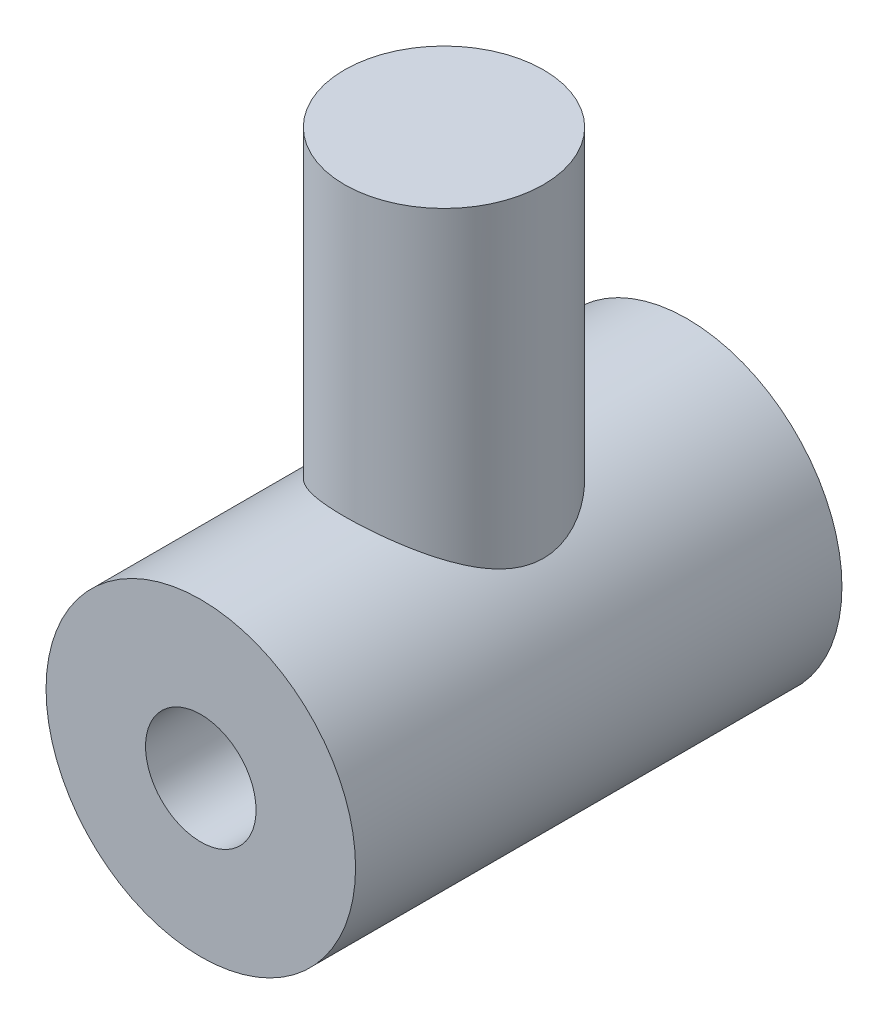
ISO-10303-21;
HEADER;
FILE_DESCRIPTION(('STEP AP214'),'2;1');
FILE_NAME('part.step','',(''),(''),'','','');
FILE_SCHEMA(('AUTOMOTIVE_DESIGN { 1 0 10303 214 1 1 1 1 }'));
ENDSEC;
DATA;
#1=APPLICATION_CONTEXT('core data for automotive mechanical design processes');
#2=APPLICATION_PROTOCOL_DEFINITION('international standard','automotive_design',2000,#1);
#3=PRODUCT_CONTEXT('',#1,'mechanical');
#4=PRODUCT('Part','Part','',(#3));
#5=PRODUCT_RELATED_PRODUCT_CATEGORY('part','',(#4));
#6=PRODUCT_DEFINITION_FORMATION('','',#4);
#7=PRODUCT_DEFINITION_CONTEXT('part definition',#1,'design');
#8=PRODUCT_DEFINITION('design','',#6,#7);
#9=PRODUCT_DEFINITION_SHAPE('','',#8);
#10=(LENGTH_UNIT() NAMED_UNIT(*) SI_UNIT(.MILLI.,.METRE.));
#11=(NAMED_UNIT(*) PLANE_ANGLE_UNIT() SI_UNIT($,.RADIAN.));
#12=(NAMED_UNIT(*) SI_UNIT($,.STERADIAN.) SOLID_ANGLE_UNIT());
#13=UNCERTAINTY_MEASURE_WITH_UNIT(LENGTH_MEASURE(1.E-05),#10,'distance_accuracy_value','');
#14=(GEOMETRIC_REPRESENTATION_CONTEXT(3) GLOBAL_UNCERTAINTY_ASSIGNED_CONTEXT((#13)) GLOBAL_UNIT_ASSIGNED_CONTEXT((#10,
#11,#12)) REPRESENTATION_CONTEXT('',''));
#15=CARTESIAN_POINT('',(0.,0.,0.));
#16=DIRECTION('',(0.,0.,1.));
#17=DIRECTION('',(1.,0.,0.));
#18=AXIS2_PLACEMENT_3D('',#15,#16,#17);
#19=CARTESIAN_POINT('',(0.,0.,44.));
#20=DIRECTION('',(0.,0.,-1.));
#21=DIRECTION('',(-1.,0.,0.));
#22=AXIS2_PLACEMENT_3D('',#19,#20,#21);
#23=CYLINDRICAL_SURFACE('',#22,14.);
#24=CARTESIAN_POINT('',(0.,0.,44.));
#25=DIRECTION('',(0.,0.,1.));
#26=DIRECTION('',(1.,0.,0.));
#27=AXIS2_PLACEMENT_3D('',#24,#25,#26);
#28=CIRCLE('',#27,14.);
#29=CARTESIAN_POINT('',(14.,0.,44.));
#30=VERTEX_POINT('',#29);
#31=EDGE_CURVE('E50',#30,#30,#28,.T.);
#32=ORIENTED_EDGE('',*,*,#31,.F.);
#33=EDGE_LOOP('',(#32));
#34=FACE_BOUND('',#33,.T.);
#35=CARTESIAN_POINT('',(0.,0.,0.));
#36=DIRECTION('',(0.,0.,1.));
#37=DIRECTION('',(1.,0.,0.));
#38=AXIS2_PLACEMENT_3D('',#35,#36,#37);
#39=CIRCLE('',#38,14.);
#40=CARTESIAN_POINT('',(14.,0.,0.));
#41=VERTEX_POINT('',#40);
#42=EDGE_CURVE('E54',#41,#41,#39,.T.);
#43=ORIENTED_EDGE('',*,*,#42,.T.);
#44=EDGE_LOOP('',(#43));
#45=FACE_BOUND('',#44,.T.);
#46=CARTESIAN_POINT('',(0.,14.,13.));
#47=CARTESIAN_POINT('',(-0.227584114263709,14.0000010523587,12.9999988244995));
#48=CARTESIAN_POINT('',(-0.455155155475848,13.9944394214491,13.0086426166343));
#49=CARTESIAN_POINT('',(-0.908539798475354,13.9723325780814,13.0430890525551));
#50=CARTESIAN_POINT('',(-1.1343527483359,13.9557834708366,13.0688977808891));
#51=CARTESIAN_POINT('',(-1.58268557077022,13.9120779988972,13.1373476155208));
#52=CARTESIAN_POINT('',(-1.80520038594632,13.8849068043828,13.1800122557582));
#53=CARTESIAN_POINT('',(-2.2449931732153,13.8206148859361,13.2815746993585));
#54=CARTESIAN_POINT('',(-2.46227153758465,13.7834949098345,13.3404712826072));
#55=CARTESIAN_POINT('',(-2.88913666728327,13.7003627407593,13.4734171316268));
#56=CARTESIAN_POINT('',(-3.09875660842831,13.6543961885736,13.547388733844));
#57=CARTESIAN_POINT('',(-3.51029963681204,13.5544328113621,13.7098404217702));
#58=CARTESIAN_POINT('',(-3.71222260586869,13.5004358630972,13.7983207301404));
#59=CARTESIAN_POINT('',(-4.10737619282889,13.385506088956,13.988910393536));
#60=CARTESIAN_POINT('',(-4.30060989003897,13.3245757475974,14.0910148687164));
#61=CARTESIAN_POINT('',(-4.67775762072026,13.1969045445948,14.3080583360774));
#62=CARTESIAN_POINT('',(-4.86166816916943,13.1301615351287,14.423002076929));
#63=CARTESIAN_POINT('',(-5.42770401989126,12.9116933952018,14.8056806890698));
#64=CARTESIAN_POINT('',(-5.79175114775062,12.7513627466614,15.0957170426228));
#65=CARTESIAN_POINT('',(-6.46927392663148,12.4213857091602,15.7259953108027));
#66=CARTESIAN_POINT('',(-6.7826779733315,12.2517265768194,16.0663070315993));
#67=CARTESIAN_POINT('',(-7.2323633835406,11.9887040552473,16.6368962570121));
#68=CARTESIAN_POINT('',(-7.38712469035751,11.8937028280017,16.8520921312977));
#69=CARTESIAN_POINT('',(-7.67789324960542,11.7081029178478,17.2967539024342));
#70=CARTESIAN_POINT('',(-7.81389667575186,11.6175051355998,17.5262226969046));
#71=CARTESIAN_POINT('',(-8.06583311344411,11.4440252086588,17.9982724844369));
#72=CARTESIAN_POINT('',(-8.18179347246911,11.3611326232973,18.2408350089503));
#73=CARTESIAN_POINT('',(-8.39252437593429,11.206365861224,18.7383396889674));
#74=CARTESIAN_POINT('',(-8.48730430526321,11.1344868089544,18.9932763004132));
#75=CARTESIAN_POINT('',(-8.63146925477076,11.0228689548488,19.4431718884227));
#76=CARTESIAN_POINT('',(-8.68618965453367,10.9797057210799,19.6355856276811));
#77=CARTESIAN_POINT('',(-8.78299303835611,10.9024252549794,20.0253296699104));
#78=CARTESIAN_POINT('',(-8.82507926449128,10.8683057021976,20.2226586974612));
#79=CARTESIAN_POINT('',(-8.89600975786495,10.8103244169902,20.6209186538799));
#80=CARTESIAN_POINT('',(-8.92487086742652,10.7864496402144,20.8218446610255));
#81=CARTESIAN_POINT('',(-8.96897989899933,10.7498013047619,21.2262063773333));
#82=CARTESIAN_POINT('',(-8.98422767770415,10.7370278629481,21.4296421128923));
#83=CARTESIAN_POINT('',(-9.00087329236168,10.7230779876452,21.8381396734402));
#84=CARTESIAN_POINT('',(-9.00222634939271,10.7219390490682,22.0432046256774));
#85=CARTESIAN_POINT('',(-8.99094192178524,10.7314032450096,22.4526739533177));
#86=CARTESIAN_POINT('',(-8.97830436883988,10.742006436857,22.6570783254907));
#87=CARTESIAN_POINT('',(-8.93924570937217,10.7745313698189,23.0637933207048));
#88=CARTESIAN_POINT('',(-8.91281467409277,10.7964612639478,23.2661023283488));
#89=CARTESIAN_POINT('',(-8.84659021172395,10.8507911739408,23.6670765107618));
#90=CARTESIAN_POINT('',(-8.80679650571715,10.8831914083506,23.8657416093807));
#91=CARTESIAN_POINT('',(-8.71586235953827,10.9561407831623,24.2520814669792));
#92=CARTESIAN_POINT('',(-8.66511985483929,10.996400327699,24.4399051819368));
#93=CARTESIAN_POINT('',(-8.55218362489436,11.0844615416764,24.8102815683309));
#94=CARTESIAN_POINT('',(-8.48998597043926,11.1322657982072,24.992832406197));
#95=CARTESIAN_POINT('',(-8.2870308542094,11.2851117674562,25.5316126320755));
#96=CARTESIAN_POINT('',(-8.1298632050726,11.3996268964678,25.879170424209));
#97=CARTESIAN_POINT('',(-7.84726764845702,11.5946929982035,26.4126499988613));
#98=CARTESIAN_POINT('',(-7.73451452449822,11.6703698168944,26.6073388362915));
#99=CARTESIAN_POINT('',(-7.49549767277604,11.8253048590925,26.9867597908817));
#100=CARTESIAN_POINT('',(-7.36923264641514,11.9045634264097,27.171490948462));
#101=CARTESIAN_POINT('',(-6.97065977989983,12.1452037368987,27.7104877777125));
#102=CARTESIAN_POINT('',(-6.67867917733987,12.3093747546297,28.0493596741495));
#103=CARTESIAN_POINT('',(-6.17526100428385,12.566250669035,28.5525913800774));
#104=CARTESIAN_POINT('',(-5.97935408914721,12.6608691190478,28.7318790268634));
#105=CARTESIAN_POINT('',(-5.57111742933795,12.8457301775098,29.073431823847));
#106=CARTESIAN_POINT('',(-5.35878492120699,12.9359720454652,29.235694098811));
#107=CARTESIAN_POINT('',(-4.91881563156702,13.1095827935413,29.541684792617));
#108=CARTESIAN_POINT('',(-4.69119195461521,13.1929574258413,29.6854287809968));
#109=CARTESIAN_POINT('',(-4.2215945025049,13.3506338458713,29.9530570024283));
#110=CARTESIAN_POINT('',(-3.97962473594526,13.4249381504561,30.0769467476781));
#111=CARTESIAN_POINT('',(-3.53208071378516,13.5486948221538,30.280840390112));
#112=CARTESIAN_POINT('',(-3.32879847718645,13.6001539098909,30.3646756495916));
#113=CARTESIAN_POINT('',(-2.91495242724517,13.6948195220994,30.5177286415945));
#114=CARTESIAN_POINT('',(-2.7043899451497,13.7380275460118,30.5869490302763));
#115=CARTESIAN_POINT('',(-2.27729014116063,13.8152456453771,30.7099542632604));
#116=CARTESIAN_POINT('',(-2.06075661227703,13.8492614181943,30.7637486698684));
#117=CARTESIAN_POINT('',(-1.62299342153234,13.907359155793,30.8552747334951));
#118=CARTESIAN_POINT('',(-1.40176367405861,13.9314409393128,30.8930060974182));
#119=CARTESIAN_POINT('',(-0.955434761233277,13.9691614934955,30.951982446389));
#120=CARTESIAN_POINT('',(-0.730324774523155,13.9827634713495,30.9731693501488));
#121=CARTESIAN_POINT('',(-0.27875079856254,13.9990478797374,30.9985241284248));
#122=CARTESIAN_POINT('',(-0.0522868088768813,14.0017303067617,31.002691997471));
#123=CARTESIAN_POINT('',(0.400183447283929,13.9961083228641,30.9939456865457));
#124=CARTESIAN_POINT('',(0.626189690131639,13.9878033585888,30.9810306462349));
#125=CARTESIAN_POINT('',(1.07593093202222,13.9604127810463,30.9383104518002));
#126=CARTESIAN_POINT('',(1.29966599332604,13.9413274641228,30.9085057619599));
#127=CARTESIAN_POINT('',(1.73091777113891,13.894184241643,30.8345411874699));
#128=CARTESIAN_POINT('',(1.93864791343421,13.8666799035894,30.7912647277375));
#129=CARTESIAN_POINT('',(2.34935677126776,13.8030330661935,30.6905262511641));
#130=CARTESIAN_POINT('',(2.55233383331183,13.7668876084032,30.6330593757482));
#131=CARTESIAN_POINT('',(2.95227642121394,13.6866962369153,30.5045969970218));
#132=CARTESIAN_POINT('',(3.1492436817517,13.6426526286864,30.4336054411867));
#133=CARTESIAN_POINT('',(3.53635492357144,13.5474700503308,30.2787484115607));
#134=CARTESIAN_POINT('',(3.72649626649201,13.496328373037,30.1948780245454));
#135=CARTESIAN_POINT('',(4.11262009384165,13.3839330149712,30.0084697688126));
#136=CARTESIAN_POINT('',(4.30802658471373,13.3222150216949,29.9050193376557));
#137=CARTESIAN_POINT('',(4.68932267687052,13.1928317683758,29.6849680350346));
#138=CARTESIAN_POINT('',(4.87520824190476,13.1251640185138,29.5683616523094));
#139=CARTESIAN_POINT('',(5.23685648362507,12.9851049765486,29.3227815878161));
#140=CARTESIAN_POINT('',(5.41261498410384,12.9127117616324,29.1938028615353));
#141=CARTESIAN_POINT('',(5.75345872233389,12.7644920967338,28.9242280912652));
#142=CARTESIAN_POINT('',(5.91854287881132,12.6886653002602,28.7836308736391));
#143=CARTESIAN_POINT('',(6.26211372085565,12.5230847426479,28.4690181864467));
#144=CARTESIAN_POINT('',(6.43877030195514,12.4329792500903,28.2931851850638));
#145=CARTESIAN_POINT('',(6.77677992498015,12.2520208958594,27.9276671667889));
#146=CARTESIAN_POINT('',(6.9381294835863,12.1611678691619,27.7379790142697));
#147=CARTESIAN_POINT('',(7.24491847850782,11.9809354051185,27.3453936903476));
#148=CARTESIAN_POINT('',(7.39035389147386,11.8915563452431,27.1424931992409));
#149=CARTESIAN_POINT('',(7.66453519513865,11.7167115834154,26.7241331032923));
#150=CARTESIAN_POINT('',(7.79328366472108,11.63124527809,26.5086754465766));
#151=CARTESIAN_POINT('',(8.01739397396806,11.4776888694133,26.0950200518325));
#152=CARTESIAN_POINT('',(8.11491961628541,11.4087935574105,25.8982926695742));
#153=CARTESIAN_POINT('',(8.29604890794173,11.277768811105,25.4963075289627));
#154=CARTESIAN_POINT('',(8.37965180987974,11.2156397400899,25.2910493133958));
#155=CARTESIAN_POINT('',(8.53204610960835,11.1001500391114,24.8729164181885));
#156=CARTESIAN_POINT('',(8.60085140759931,11.0467811914491,24.6600491073842));
#157=CARTESIAN_POINT('',(8.72285033214916,10.9507040749285,24.227624987526));
#158=CARTESIAN_POINT('',(8.77605179301215,10.9079904579559,24.0080715967214));
#159=CARTESIAN_POINT('',(8.86650123644315,10.8346019194506,23.561287965005));
#160=CARTESIAN_POINT('',(8.90358036795438,10.8040546839512,23.3340021520036));
#161=CARTESIAN_POINT('',(8.96025981543988,10.7570958867791,22.8757973645155));
#162=CARTESIAN_POINT('',(8.97986062103364,10.740683929136,22.6448784919861));
#163=CARTESIAN_POINT('',(9.00114652874405,10.7228521698632,22.1817906728734));
#164=CARTESIAN_POINT('',(9.00284395750778,10.7214220530967,21.9496226965148));
#165=CARTESIAN_POINT('',(8.98831428466094,10.7336059169077,21.4862628590491));
#166=CARTESIAN_POINT('',(8.9720887273281,10.7472186013697,21.2550709155681));
#167=CARTESIAN_POINT('',(8.92581777778007,10.7856626365133,20.8302169273008));
#168=CARTESIAN_POINT('',(8.8981962725523,10.8085164994393,20.6361032112709));
#169=CARTESIAN_POINT('',(8.83065688188754,10.8637645488616,20.2513791833468));
#170=CARTESIAN_POINT('',(8.79073551289445,10.8961614380107,20.060769880196));
#171=CARTESIAN_POINT('',(8.65322824370674,11.0061611478916,19.4956274657335));
#172=CARTESIAN_POINT('',(8.53790173700453,11.0965707538941,19.1278025824511));
#173=CARTESIAN_POINT('',(8.21717622938521,11.3371215888667,18.2930821357949));
#174=CARTESIAN_POINT('',(7.99443564846415,11.4971108667669,17.8356897183434));
#175=CARTESIAN_POINT('',(7.60909509065919,11.7526874131231,17.186975584117));
#176=CARTESIAN_POINT('',(7.47193221128204,11.8405828229634,16.9767577126606));
#177=CARTESIAN_POINT('',(7.18115062783324,12.019156557909,16.5691921956239));
#178=CARTESIAN_POINT('',(7.02753313483459,12.1098346778546,16.3718436045717));
#179=CARTESIAN_POINT('',(6.70258099882322,12.2927055894109,15.9883979871584));
#180=CARTESIAN_POINT('',(6.53105313043064,12.3849033664516,15.8024675349103));
#181=CARTESIAN_POINT('',(6.172408634954,12.5674924939702,15.4451970251483));
#182=CARTESIAN_POINT('',(5.98528769461744,12.6578833359954,15.2738610313374));
#183=CARTESIAN_POINT('',(5.59612768677738,12.8346806339906,14.946776945547));
#184=CARTESIAN_POINT('',(5.39408929836276,12.9210872710435,14.791028144749));
#185=CARTESIAN_POINT('',(4.9757943192976,13.0878633759509,14.4962048226555));
#186=CARTESIAN_POINT('',(4.75953652957909,13.1682323334434,14.3571317103566));
#187=CARTESIAN_POINT('',(4.30559630231612,13.3237181330776,14.0921945268501));
#188=CARTESIAN_POINT('',(4.06741994724241,13.3985361475645,13.9669979790424));
#189=CARTESIAN_POINT('',(3.57831663716343,13.5373639139332,13.7375206803307));
#190=CARTESIAN_POINT('',(3.32739680082482,13.6013796155761,13.6332284096617));
#191=CARTESIAN_POINT('',(2.81513481522085,13.7165505000372,13.4472767449388));
#192=CARTESIAN_POINT('',(2.55381908276724,13.7677361339783,13.3655637127333));
#193=CARTESIAN_POINT('',(2.02269361154705,13.8557236720174,13.2259460700905));
#194=CARTESIAN_POINT('',(1.75288986996507,13.892535495767,13.168025038881));
#195=CARTESIAN_POINT('',(1.23662236943415,13.9474297732984,13.0819416418491));
#196=CARTESIAN_POINT('',(0.990743763289006,13.9670927713345,13.0512615004783));
#197=CARTESIAN_POINT('',(0.496571610697543,13.9933774139404,13.0102911592719));
#198=CARTESIAN_POINT('',(0.248278026064214,13.9999988519517,13.0000012823871));
#199=CARTESIAN_POINT('',(0.,14.,13.));
#200=B_SPLINE_CURVE_WITH_KNOTS('',3,(#46,#47,#48,#49,#50,#51,#52,#53,#54,#55,#56,#57,#58,#59,
#60,#61,#62,#63,#64,#65,#66,#67,#68,#69,#70,#71,#72,#73,#74,#75,#76,#77,#78,#79,#80,#81,#82,#83,
#84,#85,#86,#87,#88,#89,#90,#91,#92,#93,#94,#95,#96,#97,#98,#99,#100,#101,#102,#103,#104,#105,
#106,#107,#108,#109,#110,#111,#112,#113,#114,#115,#116,#117,#118,#119,#120,#121,#122,#123,#124,
#125,#126,#127,#128,#129,#130,#131,#132,#133,#134,#135,#136,#137,#138,#139,#140,#141,#142,#143,
#144,#145,#146,#147,#148,#149,#150,#151,#152,#153,#154,#155,#156,#157,#158,#159,#160,#161,#162,
#163,#164,#165,#166,#167,#168,#169,#170,#171,#172,#173,#174,#175,#176,#177,#178,#179,#180,#181,
#182,#183,#184,#185,#186,#187,#188,#189,#190,#191,#192,#193,#194,#195,#196,#197,#198,#199),
.UNSPECIFIED.,.T.,.F.,(4,2,2,2,2,2,2,2,2,2,2,2,2,2,2,2,2,2,2,2,2,2,2,2,2,2,2,2,2,2,2,2,2,2,2,2,
2,2,2,2,2,2,2,2,2,2,2,2,2,2,2,2,2,2,2,2,2,2,2,2,2,2,2,2,2,2,2,2,2,2,2,2,2,2,2,2,4),(0.,
0.682499828697949,1.36524171585248,2.04894022360869,2.73258735347549,3.41279767376342,
4.09301843403755,4.77299620652987,5.45322631040961,6.92411998771171,8.39707550267104,
9.24093593815245,10.0849682528501,10.9278396892711,11.7703369119181,12.3836971164898,
12.9968997909045,13.6093193600883,14.2217453760869,14.8361444581125,15.4505465398537,
16.0653914887534,16.6802492720341,17.275693418208,17.8713421882228,19.062014612512,
19.7735935737679,20.4852409847472,21.9092368633558,22.7541617869071,23.5992291719351,
24.4435813509131,25.2876987020057,25.9645084081527,26.641195002415,27.3174612188173,
27.993739774241,28.6723819435748,29.3510243310298,30.029700897965,30.7083588095057,
31.3495470323436,31.9909550930685,32.6321762307612,33.2736426023975,33.9616166404412,
34.6498799606648,35.3384251055152,36.027039888675,36.8213134068591,37.6157672412939,
38.4104214645024,39.2049527310626,39.8947156280704,40.5845155410229,41.2736646292235,
41.9624671179228,42.6583192606423,43.3541519098774,44.049505440344,44.7447990625336,
45.3363259526669,45.9280205287428,47.1114778505535,48.7024785864662,49.4997207646004,
50.2969043053252,51.103810094242,51.9109398297573,52.7180328448307,53.5251940064868,
54.3618204632096,55.1979846031095,56.0321449725389,56.8657286495681,57.6102754605091,
58.3548340638479),.UNSPECIFIED.);
#201=CARTESIAN_POINT('',(0.,14.,13.));
#202=VERTEX_POINT('',#201);
#203=EDGE_CURVE('E10',#202,#202,#200,.T.);
#204=ORIENTED_EDGE('',*,*,#203,.F.);
#205=EDGE_LOOP('',(#204));
#206=FACE_BOUND('',#205,.T.);
#207=ADVANCED_FACE('F39',(#34,#45,#206),#23,.T.);
#208=CARTESIAN_POINT('',(0.,0.,44.));
#209=DIRECTION('',(0.,0.,1.));
#210=DIRECTION('',(1.,0.,0.));
#211=AXIS2_PLACEMENT_3D('',#208,#209,#210);
#212=PLANE('',#211);
#213=CARTESIAN_POINT('',(0.,0.,44.));
#214=DIRECTION('',(0.,0.,1.));
#215=DIRECTION('',(1.,0.,0.));
#216=AXIS2_PLACEMENT_3D('',#213,#214,#215);
#217=CIRCLE('',#216,5.);
#218=CARTESIAN_POINT('',(5.,0.,44.));
#219=VERTEX_POINT('',#218);
#220=EDGE_CURVE('E64',#219,#219,#217,.T.);
#221=ORIENTED_EDGE('',*,*,#220,.F.);
#222=EDGE_LOOP('',(#221));
#223=FACE_BOUND('',#222,.T.);
#224=ORIENTED_EDGE('',*,*,#31,.T.);
#225=EDGE_LOOP('',(#224));
#226=FACE_BOUND('',#225,.T.);
#227=ADVANCED_FACE('F80',(#223,#226),#212,.T.);
#228=CARTESIAN_POINT('',(0.,0.,0.));
#229=DIRECTION('',(0.,0.,1.));
#230=DIRECTION('',(1.,0.,0.));
#231=AXIS2_PLACEMENT_3D('',#228,#229,#230);
#232=PLANE('',#231);
#233=CARTESIAN_POINT('',(0.,0.,0.));
#234=DIRECTION('',(0.,0.,1.));
#235=DIRECTION('',(1.,0.,0.));
#236=AXIS2_PLACEMENT_3D('',#233,#234,#235);
#237=CIRCLE('',#236,5.);
#238=CARTESIAN_POINT('',(5.,0.,0.));
#239=VERTEX_POINT('',#238);
#240=EDGE_CURVE('E63',#239,#239,#237,.T.);
#241=ORIENTED_EDGE('',*,*,#240,.T.);
#242=EDGE_LOOP('',(#241));
#243=FACE_BOUND('',#242,.T.);
#244=ORIENTED_EDGE('',*,*,#42,.F.);
#245=EDGE_LOOP('',(#244));
#246=FACE_BOUND('',#245,.T.);
#247=ADVANCED_FACE('F70',(#243,#246),#232,.F.);
#248=CARTESIAN_POINT('',(0.,40.,22.));
#249=DIRECTION('',(0.,-1.,0.));
#250=DIRECTION('',(0.,0.,-1.));
#251=AXIS2_PLACEMENT_3D('',#248,#249,#250);
#252=CYLINDRICAL_SURFACE('',#251,9.);
#253=CARTESIAN_POINT('',(0.,40.,22.));
#254=DIRECTION('',(0.,1.,0.));
#255=DIRECTION('',(0.,0.,1.));
#256=AXIS2_PLACEMENT_3D('',#253,#254,#255);
#257=CIRCLE('',#256,9.);
#258=CARTESIAN_POINT('',(0.,40.,31.));
#259=VERTEX_POINT('',#258);
#260=EDGE_CURVE('E59',#259,#259,#257,.T.);
#261=ORIENTED_EDGE('',*,*,#260,.F.);
#262=EDGE_LOOP('',(#261));
#263=FACE_BOUND('',#262,.T.);
#264=ORIENTED_EDGE('',*,*,#203,.T.);
#265=EDGE_LOOP('',(#264));
#266=FACE_BOUND('',#265,.T.);
#267=ADVANCED_FACE('F87',(#263,#266),#252,.T.);
#268=CARTESIAN_POINT('',(0.,40.,22.));
#269=DIRECTION('',(0.,1.,0.));
#270=DIRECTION('',(0.,0.,1.));
#271=AXIS2_PLACEMENT_3D('',#268,#269,#270);
#272=PLANE('',#271);
#273=ORIENTED_EDGE('',*,*,#260,.T.);
#274=EDGE_LOOP('',(#273));
#275=FACE_BOUND('',#274,.T.);
#276=ADVANCED_FACE('F76',(#275),#272,.T.);
#277=CARTESIAN_POINT('',(0.,0.,0.));
#278=DIRECTION('',(0.,0.,1.));
#279=DIRECTION('',(1.,0.,0.));
#280=AXIS2_PLACEMENT_3D('',#277,#278,#279);
#281=CYLINDRICAL_SURFACE('',#280,5.);
#282=ORIENTED_EDGE('',*,*,#240,.F.);
#283=EDGE_LOOP('',(#282));
#284=FACE_BOUND('',#283,.T.);
#285=ORIENTED_EDGE('',*,*,#220,.T.);
#286=EDGE_LOOP('',(#285));
#287=FACE_BOUND('',#286,.T.);
#288=ADVANCED_FACE('F73',(#284,#287),#281,.F.);
#289=CLOSED_SHELL('',(#207,#227,#247,#267,#276,#288));
#290=MANIFOLD_SOLID_BREP('B2',#289);
#291=ADVANCED_BREP_SHAPE_REPRESENTATION('',(#18,#290),#14);
#292=SHAPE_DEFINITION_REPRESENTATION(#9,#291);
ENDSEC;
END-ISO-10303-21;
